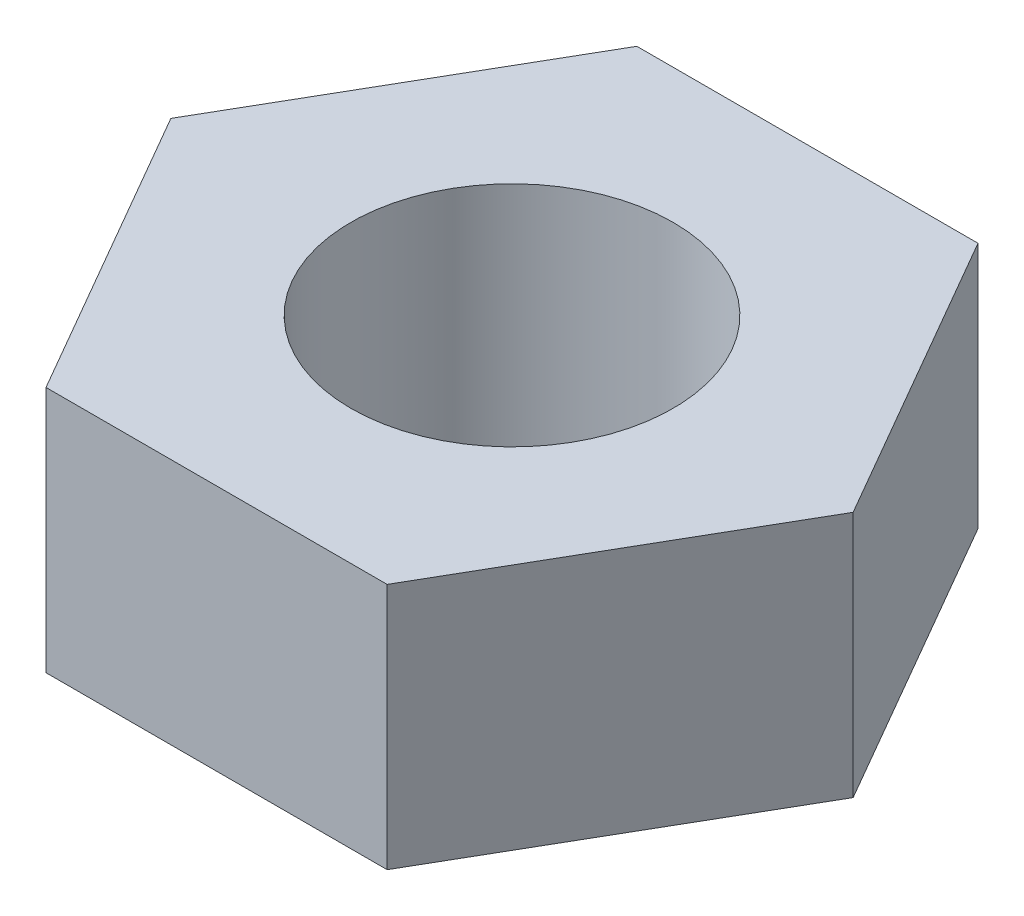
ISO-10303-21;
HEADER;
FILE_DESCRIPTION(('STEP AP214'),'2;1');
FILE_NAME('part.step','',(''),(''),'','','');
FILE_SCHEMA(('AUTOMOTIVE_DESIGN { 1 0 10303 214 1 1 1 1 }'));
ENDSEC;
DATA;
#1=APPLICATION_CONTEXT('core data for automotive mechanical design processes');
#2=APPLICATION_PROTOCOL_DEFINITION('international standard','automotive_design',2000,#1);
#3=PRODUCT_CONTEXT('',#1,'mechanical');
#4=PRODUCT('Part','Part','',(#3));
#5=PRODUCT_RELATED_PRODUCT_CATEGORY('part','',(#4));
#6=PRODUCT_DEFINITION_FORMATION('','',#4);
#7=PRODUCT_DEFINITION_CONTEXT('part definition',#1,'design');
#8=PRODUCT_DEFINITION('design','',#6,#7);
#9=PRODUCT_DEFINITION_SHAPE('','',#8);
#10=(LENGTH_UNIT() NAMED_UNIT(*) SI_UNIT(.MILLI.,.METRE.));
#11=(NAMED_UNIT(*) PLANE_ANGLE_UNIT() SI_UNIT($,.RADIAN.));
#12=(NAMED_UNIT(*) SI_UNIT($,.STERADIAN.) SOLID_ANGLE_UNIT());
#13=UNCERTAINTY_MEASURE_WITH_UNIT(LENGTH_MEASURE(1.E-05),#10,'distance_accuracy_value','');
#14=(GEOMETRIC_REPRESENTATION_CONTEXT(3) GLOBAL_UNCERTAINTY_ASSIGNED_CONTEXT((#13)) GLOBAL_UNIT_ASSIGNED_CONTEXT((#10,
#11,#12)) REPRESENTATION_CONTEXT('',''));
#15=CARTESIAN_POINT('',(0.,0.,0.));
#16=DIRECTION('',(0.,0.,1.));
#17=DIRECTION('',(1.,0.,0.));
#18=AXIS2_PLACEMENT_3D('',#15,#16,#17);
#19=CARTESIAN_POINT('',(0.,2.3,0.));
#20=DIRECTION('',(0.,1.,0.));
#21=DIRECTION('',(0.,0.,1.));
#22=AXIS2_PLACEMENT_3D('',#19,#20,#21);
#23=PLANE('',#22);
#24=DIRECTION('',(0.499999999999995,0.,-0.866025403784441));
#25=VECTOR('',#24,1.);
#26=CARTESIAN_POINT('',(1.5877132402715,2.3,2.74999999999998));
#27=LINE('',#26,#25);
#28=CARTESIAN_POINT('',(1.5877132402715,2.3,2.74999999999998));
#29=VERTEX_POINT('',#28);
#30=CARTESIAN_POINT('',(3.17542648054294,2.3,0.));
#31=VERTEX_POINT('',#30);
#32=EDGE_CURVE('E152',#29,#31,#27,.T.);
#33=ORIENTED_EDGE('',*,*,#32,.T.);
#34=DIRECTION('',(-0.500000000000001,0.,-0.866025403784438));
#35=VECTOR('',#34,1.);
#36=CARTESIAN_POINT('',(3.17542648054294,2.3,0.));
#37=LINE('',#36,#35);
#38=CARTESIAN_POINT('',(1.58771324027147,2.3,-2.75000000000001));
#39=VERTEX_POINT('',#38);
#40=EDGE_CURVE('E100',#31,#39,#37,.T.);
#41=ORIENTED_EDGE('',*,*,#40,.T.);
#42=DIRECTION('',(-1.,0.,0.));
#43=VECTOR('',#42,1.);
#44=CARTESIAN_POINT('',(1.58771324027147,2.3,-2.75000000000001));
#45=LINE('',#44,#43);
#46=CARTESIAN_POINT('',(-1.58771324027148,2.3,-2.74999999999999));
#47=VERTEX_POINT('',#46);
#48=EDGE_CURVE('E113',#39,#47,#45,.T.);
#49=ORIENTED_EDGE('',*,*,#48,.T.);
#50=DIRECTION('',(-0.499999999999995,0.,0.866025403784442));
#51=VECTOR('',#50,1.);
#52=CARTESIAN_POINT('',(-1.58771324027148,2.3,-2.74999999999999));
#53=LINE('',#52,#51);
#54=CARTESIAN_POINT('',(-3.17542648054294,2.3,0.));
#55=VERTEX_POINT('',#54);
#56=EDGE_CURVE('E107',#47,#55,#53,.T.);
#57=ORIENTED_EDGE('',*,*,#56,.T.);
#58=DIRECTION('',(0.500000000000007,0.,0.866025403784435));
#59=VECTOR('',#58,1.);
#60=CARTESIAN_POINT('',(-3.17542648054294,2.3,0.));
#61=LINE('',#60,#59);
#62=CARTESIAN_POINT('',(-1.58771324027145,2.3,2.75000000000002));
#63=VERTEX_POINT('',#62);
#64=EDGE_CURVE('E111',#55,#63,#61,.T.);
#65=ORIENTED_EDGE('',*,*,#64,.T.);
#66=DIRECTION('',(1.,0.,0.));
#67=VECTOR('',#66,1.);
#68=CARTESIAN_POINT('',(-1.58771324027145,2.3,2.75000000000002));
#69=LINE('',#68,#67);
#70=EDGE_CURVE('E63',#63,#29,#69,.T.);
#71=ORIENTED_EDGE('',*,*,#70,.T.);
#72=EDGE_LOOP('',(#33,#41,#49,#57,#65,#71));
#73=FACE_BOUND('',#72,.T.);
#74=CARTESIAN_POINT('',(0.,2.3,0.));
#75=DIRECTION('',(0.,1.,0.));
#76=DIRECTION('',(0.,0.,1.));
#77=AXIS2_PLACEMENT_3D('',#74,#75,#76);
#78=CIRCLE('',#77,1.5);
#79=CARTESIAN_POINT('',(0.,2.3,1.5));
#80=VERTEX_POINT('',#79);
#81=EDGE_CURVE('E140',#80,#80,#78,.T.);
#82=ORIENTED_EDGE('',*,*,#81,.F.);
#83=EDGE_LOOP('',(#82));
#84=FACE_BOUND('',#83,.T.);
#85=ADVANCED_FACE('F45',(#73,#84),#23,.T.);
#86=CARTESIAN_POINT('',(0.,0.,0.));
#87=DIRECTION('',(0.,1.,0.));
#88=DIRECTION('',(0.,0.,1.));
#89=AXIS2_PLACEMENT_3D('',#86,#87,#88);
#90=PLANE('',#89);
#91=DIRECTION('',(0.499999999999995,0.,-0.866025403784441));
#92=VECTOR('',#91,1.);
#93=CARTESIAN_POINT('',(1.5877132402715,0.,2.74999999999998));
#94=LINE('',#93,#92);
#95=CARTESIAN_POINT('',(1.5877132402715,0.,2.74999999999998));
#96=VERTEX_POINT('',#95);
#97=CARTESIAN_POINT('',(3.17542648054294,0.,0.));
#98=VERTEX_POINT('',#97);
#99=EDGE_CURVE('E135',#96,#98,#94,.T.);
#100=ORIENTED_EDGE('',*,*,#99,.F.);
#101=DIRECTION('',(1.,0.,0.));
#102=VECTOR('',#101,1.);
#103=CARTESIAN_POINT('',(-1.58771324027145,0.,2.75000000000002));
#104=LINE('',#103,#102);
#105=CARTESIAN_POINT('',(-1.58771324027145,0.,2.75000000000002));
#106=VERTEX_POINT('',#105);
#107=EDGE_CURVE('E92',#106,#96,#104,.T.);
#108=ORIENTED_EDGE('',*,*,#107,.F.);
#109=DIRECTION('',(0.500000000000007,0.,0.866025403784435));
#110=VECTOR('',#109,1.);
#111=CARTESIAN_POINT('',(-3.17542648054294,0.,0.));
#112=LINE('',#111,#110);
#113=CARTESIAN_POINT('',(-3.17542648054294,0.,0.));
#114=VERTEX_POINT('',#113);
#115=EDGE_CURVE('E86',#114,#106,#112,.T.);
#116=ORIENTED_EDGE('',*,*,#115,.F.);
#117=DIRECTION('',(-0.499999999999995,0.,0.866025403784442));
#118=VECTOR('',#117,1.);
#119=CARTESIAN_POINT('',(-1.58771324027148,0.,-2.74999999999999));
#120=LINE('',#119,#118);
#121=CARTESIAN_POINT('',(-1.58771324027148,0.,-2.74999999999999));
#122=VERTEX_POINT('',#121);
#123=EDGE_CURVE('E122',#122,#114,#120,.T.);
#124=ORIENTED_EDGE('',*,*,#123,.F.);
#125=DIRECTION('',(-1.,0.,0.));
#126=VECTOR('',#125,1.);
#127=CARTESIAN_POINT('',(1.58771324027147,0.,-2.75000000000001));
#128=LINE('',#127,#126);
#129=CARTESIAN_POINT('',(1.58771324027147,0.,-2.75000000000001));
#130=VERTEX_POINT('',#129);
#131=EDGE_CURVE('E143',#130,#122,#128,.T.);
#132=ORIENTED_EDGE('',*,*,#131,.F.);
#133=DIRECTION('',(-0.500000000000001,0.,-0.866025403784438));
#134=VECTOR('',#133,1.);
#135=CARTESIAN_POINT('',(3.17542648054294,0.,0.));
#136=LINE('',#135,#134);
#137=EDGE_CURVE('E139',#98,#130,#136,.T.);
#138=ORIENTED_EDGE('',*,*,#137,.F.);
#139=EDGE_LOOP('',(#100,#108,#116,#124,#132,#138));
#140=FACE_BOUND('',#139,.T.);
#141=CARTESIAN_POINT('',(0.,0.,0.));
#142=DIRECTION('',(0.,1.,0.));
#143=DIRECTION('',(0.,0.,1.));
#144=AXIS2_PLACEMENT_3D('',#141,#142,#143);
#145=CIRCLE('',#144,1.5);
#146=CARTESIAN_POINT('',(0.,0.,1.5));
#147=VERTEX_POINT('',#146);
#148=EDGE_CURVE('E285',#147,#147,#145,.T.);
#149=ORIENTED_EDGE('',*,*,#148,.T.);
#150=EDGE_LOOP('',(#149));
#151=FACE_BOUND('',#150,.T.);
#152=ADVANCED_FACE('F165',(#140,#151),#90,.F.);
#153=CARTESIAN_POINT('',(1.5877132402715,2.3,2.74999999999998));
#154=DIRECTION('',(-0.866025403784441,0.,-0.499999999999995));
#155=DIRECTION('',(-0.499999999999995,0.,0.866025403784441));
#156=AXIS2_PLACEMENT_3D('',#153,#154,#155);
#157=PLANE('',#156);
#158=ORIENTED_EDGE('',*,*,#99,.T.);
#159=DIRECTION('',(0.,-1.,0.));
#160=VECTOR('',#159,1.);
#161=CARTESIAN_POINT('',(3.17542648054294,2.3,0.));
#162=LINE('',#161,#160);
#163=EDGE_CURVE('E11',#31,#98,#162,.T.);
#164=ORIENTED_EDGE('',*,*,#163,.F.);
#165=ORIENTED_EDGE('',*,*,#32,.F.);
#166=DIRECTION('',(0.,-1.,0.));
#167=VECTOR('',#166,1.);
#168=CARTESIAN_POINT('',(1.5877132402715,2.3,2.74999999999998));
#169=LINE('',#168,#167);
#170=EDGE_CURVE('E131',#29,#96,#169,.T.);
#171=ORIENTED_EDGE('',*,*,#170,.T.);
#172=EDGE_LOOP('',(#158,#164,#165,#171));
#173=FACE_BOUND('',#172,.T.);
#174=ADVANCED_FACE('F47',(#173),#157,.F.);
#175=CARTESIAN_POINT('',(3.17542648054294,2.3,0.));
#176=DIRECTION('',(-0.866025403784438,0.,0.500000000000001));
#177=DIRECTION('',(0.500000000000001,0.,0.866025403784438));
#178=AXIS2_PLACEMENT_3D('',#175,#176,#177);
#179=PLANE('',#178);
#180=ORIENTED_EDGE('',*,*,#137,.T.);
#181=DIRECTION('',(0.,-1.,0.));
#182=VECTOR('',#181,1.);
#183=CARTESIAN_POINT('',(1.58771324027147,2.3,-2.75000000000001));
#184=LINE('',#183,#182);
#185=EDGE_CURVE('E55',#39,#130,#184,.T.);
#186=ORIENTED_EDGE('',*,*,#185,.F.);
#187=ORIENTED_EDGE('',*,*,#40,.F.);
#188=ORIENTED_EDGE('',*,*,#163,.T.);
#189=EDGE_LOOP('',(#180,#186,#187,#188));
#190=FACE_BOUND('',#189,.T.);
#191=ADVANCED_FACE('F190',(#190),#179,.F.);
#192=CARTESIAN_POINT('',(1.58771324027147,2.3,-2.75000000000001));
#193=DIRECTION('',(0.,0.,1.));
#194=DIRECTION('',(1.,0.,0.));
#195=AXIS2_PLACEMENT_3D('',#192,#193,#194);
#196=PLANE('',#195);
#197=ORIENTED_EDGE('',*,*,#131,.T.);
#198=DIRECTION('',(0.,-1.,0.));
#199=VECTOR('',#198,1.);
#200=CARTESIAN_POINT('',(-1.58771324027148,2.3,-2.74999999999999));
#201=LINE('',#200,#199);
#202=EDGE_CURVE('E124',#47,#122,#201,.T.);
#203=ORIENTED_EDGE('',*,*,#202,.F.);
#204=ORIENTED_EDGE('',*,*,#48,.F.);
#205=ORIENTED_EDGE('',*,*,#185,.T.);
#206=EDGE_LOOP('',(#197,#203,#204,#205));
#207=FACE_BOUND('',#206,.T.);
#208=ADVANCED_FACE('F162',(#207),#196,.F.);
#209=CARTESIAN_POINT('',(-1.58771324027148,2.3,-2.74999999999999));
#210=DIRECTION('',(0.866025403784442,0.,0.499999999999995));
#211=DIRECTION('',(0.499999999999995,0.,-0.866025403784442));
#212=AXIS2_PLACEMENT_3D('',#209,#210,#211);
#213=PLANE('',#212);
#214=ORIENTED_EDGE('',*,*,#123,.T.);
#215=DIRECTION('',(0.,-1.,0.));
#216=VECTOR('',#215,1.);
#217=CARTESIAN_POINT('',(-3.17542648054294,2.3,0.));
#218=LINE('',#217,#216);
#219=EDGE_CURVE('E119',#55,#114,#218,.T.);
#220=ORIENTED_EDGE('',*,*,#219,.F.);
#221=ORIENTED_EDGE('',*,*,#56,.F.);
#222=ORIENTED_EDGE('',*,*,#202,.T.);
#223=EDGE_LOOP('',(#214,#220,#221,#222));
#224=FACE_BOUND('',#223,.T.);
#225=ADVANCED_FACE('F120',(#224),#213,.F.);
#226=CARTESIAN_POINT('',(-3.17542648054294,2.3,0.));
#227=DIRECTION('',(0.866025403784435,0.,-0.500000000000007));
#228=DIRECTION('',(-0.500000000000007,0.,-0.866025403784435));
#229=AXIS2_PLACEMENT_3D('',#226,#227,#228);
#230=PLANE('',#229);
#231=ORIENTED_EDGE('',*,*,#115,.T.);
#232=DIRECTION('',(0.,-1.,0.));
#233=VECTOR('',#232,1.);
#234=CARTESIAN_POINT('',(-1.58771324027145,2.3,2.75000000000002));
#235=LINE('',#234,#233);
#236=EDGE_CURVE('E125',#63,#106,#235,.T.);
#237=ORIENTED_EDGE('',*,*,#236,.F.);
#238=ORIENTED_EDGE('',*,*,#64,.F.);
#239=ORIENTED_EDGE('',*,*,#219,.T.);
#240=EDGE_LOOP('',(#231,#237,#238,#239));
#241=FACE_BOUND('',#240,.T.);
#242=ADVANCED_FACE('F127',(#241),#230,.F.);
#243=CARTESIAN_POINT('',(-1.58771324027145,2.3,2.75000000000002));
#244=DIRECTION('',(0.,0.,-1.));
#245=DIRECTION('',(-1.,0.,0.));
#246=AXIS2_PLACEMENT_3D('',#243,#244,#245);
#247=PLANE('',#246);
#248=ORIENTED_EDGE('',*,*,#107,.T.);
#249=ORIENTED_EDGE('',*,*,#170,.F.);
#250=ORIENTED_EDGE('',*,*,#70,.F.);
#251=ORIENTED_EDGE('',*,*,#236,.T.);
#252=EDGE_LOOP('',(#248,#249,#250,#251));
#253=FACE_BOUND('',#252,.T.);
#254=ADVANCED_FACE('F170',(#253),#247,.F.);
#255=CARTESIAN_POINT('',(0.,2.3,0.));
#256=DIRECTION('',(0.,-1.,0.));
#257=DIRECTION('',(0.,0.,-1.));
#258=AXIS2_PLACEMENT_3D('',#255,#256,#257);
#259=CYLINDRICAL_SURFACE('',#258,1.5);
#260=ORIENTED_EDGE('',*,*,#81,.T.);
#261=EDGE_LOOP('',(#260));
#262=FACE_BOUND('',#261,.T.);
#263=ORIENTED_EDGE('',*,*,#148,.F.);
#264=EDGE_LOOP('',(#263));
#265=FACE_BOUND('',#264,.T.);
#266=ADVANCED_FACE('F172',(#262,#265),#259,.F.);
#267=CLOSED_SHELL('',(#85,#152,#174,#191,#208,#225,#242,#254,#266));
#268=MANIFOLD_SOLID_BREP('B2',#267);
#269=ADVANCED_BREP_SHAPE_REPRESENTATION('',(#18,#268),#14);
#270=SHAPE_DEFINITION_REPRESENTATION(#9,#269);
ENDSEC;
END-ISO-10303-21;
